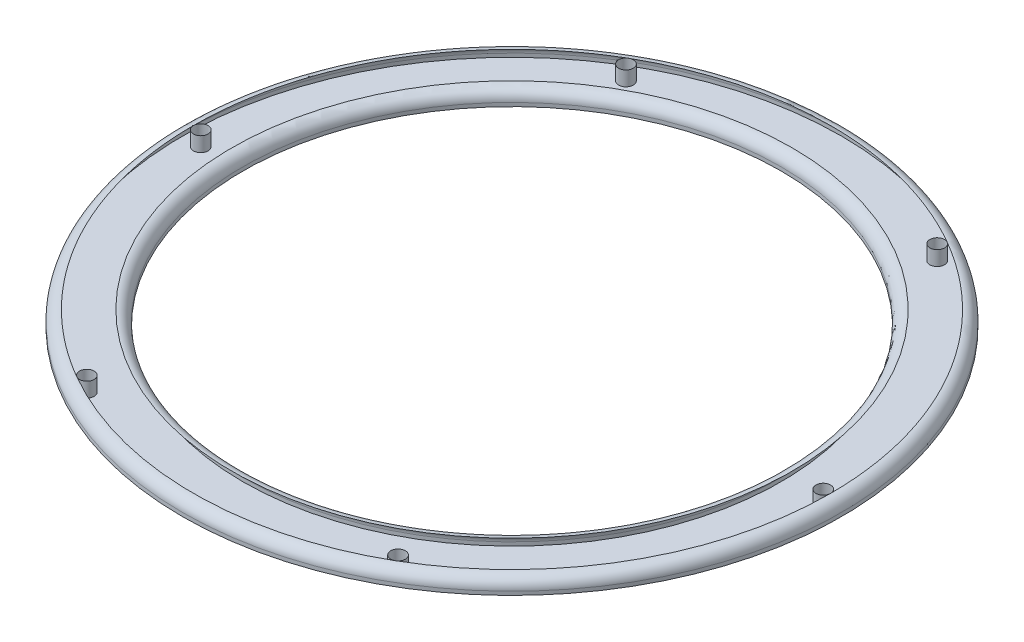
ISO-10303-21;
HEADER;
FILE_DESCRIPTION(('STEP AP214'),'2;1');
FILE_NAME('part.step','',(''),(''),'','','');
FILE_SCHEMA(('AUTOMOTIVE_DESIGN { 1 0 10303 214 1 1 1 1 }'));
ENDSEC;
DATA;
#1=APPLICATION_CONTEXT('core data for automotive mechanical design processes');
#2=APPLICATION_PROTOCOL_DEFINITION('international standard','automotive_design',2000,#1);
#3=PRODUCT_CONTEXT('',#1,'mechanical');
#4=PRODUCT('Part','Part','',(#3));
#5=PRODUCT_RELATED_PRODUCT_CATEGORY('part','',(#4));
#6=PRODUCT_DEFINITION_FORMATION('','',#4);
#7=PRODUCT_DEFINITION_CONTEXT('part definition',#1,'design');
#8=PRODUCT_DEFINITION('design','',#6,#7);
#9=PRODUCT_DEFINITION_SHAPE('','',#8);
#10=(LENGTH_UNIT() NAMED_UNIT(*) SI_UNIT(.MILLI.,.METRE.));
#11=(NAMED_UNIT(*) PLANE_ANGLE_UNIT() SI_UNIT($,.RADIAN.));
#12=(NAMED_UNIT(*) SI_UNIT($,.STERADIAN.) SOLID_ANGLE_UNIT());
#13=UNCERTAINTY_MEASURE_WITH_UNIT(LENGTH_MEASURE(1.E-05),#10,'distance_accuracy_value','');
#14=(GEOMETRIC_REPRESENTATION_CONTEXT(3) GLOBAL_UNCERTAINTY_ASSIGNED_CONTEXT((#13)) GLOBAL_UNIT_ASSIGNED_CONTEXT((#10,
#11,#12)) REPRESENTATION_CONTEXT('',''));
#15=CARTESIAN_POINT('',(0.,0.,0.));
#16=DIRECTION('',(0.,0.,1.));
#17=DIRECTION('',(1.,0.,0.));
#18=AXIS2_PLACEMENT_3D('',#15,#16,#17);
#19=CARTESIAN_POINT('',(0.,0.,0.));
#20=DIRECTION('',(0.,-1.,0.));
#21=DIRECTION('',(0.,0.,-1.));
#22=AXIS2_PLACEMENT_3D('',#19,#20,#21);
#23=CYLINDRICAL_SURFACE('',#22,73.5);
#24=CARTESIAN_POINT('',(0.,1.,0.));
#25=DIRECTION('',(0.,-1.,0.));
#26=DIRECTION('',(0.,0.,-1.));
#27=AXIS2_PLACEMENT_3D('',#24,#25,#26);
#28=CIRCLE('',#27,73.5);
#29=CARTESIAN_POINT('',(0.,1.,-73.5));
#30=VERTEX_POINT('',#29);
#31=EDGE_CURVE('E97',#30,#30,#28,.T.);
#32=ORIENTED_EDGE('',*,*,#31,.F.);
#33=EDGE_LOOP('',(#32));
#34=FACE_BOUND('',#33,.T.);
#35=CARTESIAN_POINT('',(0.,0.,0.));
#36=DIRECTION('',(0.,-1.,0.));
#37=DIRECTION('',(0.,0.,-1.));
#38=AXIS2_PLACEMENT_3D('',#35,#36,#37);
#39=CIRCLE('',#38,73.5);
#40=CARTESIAN_POINT('',(0.,0.,-73.5));
#41=VERTEX_POINT('',#40);
#42=EDGE_CURVE('E11',#41,#41,#39,.T.);
#43=ORIENTED_EDGE('',*,*,#42,.T.);
#44=EDGE_LOOP('',(#43));
#45=FACE_BOUND('',#44,.T.);
#46=ADVANCED_FACE('F39',(#34,#45),#23,.F.);
#47=CARTESIAN_POINT('',(-73.5,0.,0.));
#48=DIRECTION('',(0.,1.,0.));
#49=DIRECTION('',(0.,0.,1.));
#50=AXIS2_PLACEMENT_3D('',#47,#48,#49);
#51=PLANE('',#50);
#52=CARTESIAN_POINT('',(-42.5000000000009,0.,-73.6121593216768));
#53=DIRECTION('',(0.,1.,0.));
#54=DIRECTION('',(-0.866025403784433,0.,0.50000000000001));
#55=AXIS2_PLACEMENT_3D('',#52,#53,#54);
#56=CIRCLE('',#55,2.);
#57=CARTESIAN_POINT('',(-44.2320508075697,0.,-72.6121593216768));
#58=VERTEX_POINT('',#57);
#59=EDGE_CURVE('E200',#58,#58,#56,.T.);
#60=ORIENTED_EDGE('',*,*,#59,.T.);
#61=EDGE_LOOP('',(#60));
#62=FACE_BOUND('',#61,.T.);
#63=CARTESIAN_POINT('',(42.4999999999993,0.,-73.6121593216777));
#64=DIRECTION('',(0.,1.,0.));
#65=DIRECTION('',(-0.866025403784443,0.,-0.499999999999992));
#66=AXIS2_PLACEMENT_3D('',#63,#64,#65);
#67=CIRCLE('',#66,2.);
#68=CARTESIAN_POINT('',(40.7679491924304,0.,-74.6121593216777));
#69=VERTEX_POINT('',#68);
#70=EDGE_CURVE('E193',#69,#69,#67,.T.);
#71=ORIENTED_EDGE('',*,*,#70,.T.);
#72=EDGE_LOOP('',(#71));
#73=FACE_BOUND('',#72,.T.);
#74=CARTESIAN_POINT('',(85.,0.,0.));
#75=DIRECTION('',(0.,1.,0.));
#76=DIRECTION('',(0.,0.,-1.));
#77=AXIS2_PLACEMENT_3D('',#74,#75,#76);
#78=CIRCLE('',#77,2.);
#79=CARTESIAN_POINT('',(85.,0.,-2.));
#80=VERTEX_POINT('',#79);
#81=EDGE_CURVE('E184',#80,#80,#78,.T.);
#82=ORIENTED_EDGE('',*,*,#81,.T.);
#83=EDGE_LOOP('',(#82));
#84=FACE_BOUND('',#83,.T.);
#85=CARTESIAN_POINT('',(42.5000000000003,0.,73.6121593216771));
#86=DIRECTION('',(0.,1.,0.));
#87=DIRECTION('',(0.866025403784436,0.,-0.500000000000004));
#88=AXIS2_PLACEMENT_3D('',#85,#86,#87);
#89=CIRCLE('',#88,2.);
#90=CARTESIAN_POINT('',(44.2320508075692,0.,72.6121593216771));
#91=VERTEX_POINT('',#90);
#92=EDGE_CURVE('E178',#91,#91,#89,.T.);
#93=ORIENTED_EDGE('',*,*,#92,.T.);
#94=EDGE_LOOP('',(#93));
#95=FACE_BOUND('',#94,.T.);
#96=CARTESIAN_POINT('',(-42.4999999999998,0.,73.6121593216774));
#97=DIRECTION('',(0.,1.,0.));
#98=DIRECTION('',(0.86602540378444,0.,0.499999999999998));
#99=AXIS2_PLACEMENT_3D('',#96,#97,#98);
#100=CIRCLE('',#99,2.);
#101=CARTESIAN_POINT('',(-40.767949192431,0.,74.6121593216774));
#102=VERTEX_POINT('',#101);
#103=EDGE_CURVE('E92',#102,#102,#100,.T.);
#104=ORIENTED_EDGE('',*,*,#103,.T.);
#105=EDGE_LOOP('',(#104));
#106=FACE_BOUND('',#105,.T.);
#107=CARTESIAN_POINT('',(-85.,0.,0.));
#108=DIRECTION('',(0.,1.,0.));
#109=DIRECTION('',(0.,0.,1.));
#110=AXIS2_PLACEMENT_3D('',#107,#108,#109);
#111=CIRCLE('',#110,2.);
#112=CARTESIAN_POINT('',(-85.,0.,2.));
#113=VERTEX_POINT('',#112);
#114=EDGE_CURVE('E91',#113,#113,#111,.T.);
#115=ORIENTED_EDGE('',*,*,#114,.T.);
#116=EDGE_LOOP('',(#115));
#117=FACE_BOUND('',#116,.T.);
#118=ORIENTED_EDGE('',*,*,#42,.F.);
#119=EDGE_LOOP('',(#118));
#120=FACE_BOUND('',#119,.T.);
#121=CARTESIAN_POINT('',(0.,0.,0.));
#122=DIRECTION('',(0.,-1.,0.));
#123=DIRECTION('',(0.,0.,-1.));
#124=AXIS2_PLACEMENT_3D('',#121,#122,#123);
#125=CIRCLE('',#124,90.);
#126=CARTESIAN_POINT('',(0.,0.,-90.));
#127=VERTEX_POINT('',#126);
#128=EDGE_CURVE('E47',#127,#127,#125,.T.);
#129=ORIENTED_EDGE('',*,*,#128,.T.);
#130=EDGE_LOOP('',(#129));
#131=FACE_BOUND('',#130,.T.);
#132=ADVANCED_FACE('F118',(#62,#73,#84,#95,#106,#117,#120,#131),#51,.F.);
#133=CARTESIAN_POINT('',(0.,0.,0.));
#134=DIRECTION('',(0.,-1.,0.));
#135=DIRECTION('',(0.,0.,-1.));
#136=AXIS2_PLACEMENT_3D('',#133,#134,#135);
#137=CYLINDRICAL_SURFACE('',#136,90.);
#138=ORIENTED_EDGE('',*,*,#128,.F.);
#139=EDGE_LOOP('',(#138));
#140=FACE_BOUND('',#139,.T.);
#141=CARTESIAN_POINT('',(0.,0.999999999999998,0.));
#142=DIRECTION('',(0.,-1.,0.));
#143=DIRECTION('',(0.,0.,-1.));
#144=AXIS2_PLACEMENT_3D('',#141,#142,#143);
#145=CIRCLE('',#144,90.);
#146=CARTESIAN_POINT('',(0.,0.999999999999998,-90.));
#147=VERTEX_POINT('',#146);
#148=EDGE_CURVE('E110',#147,#147,#145,.T.);
#149=ORIENTED_EDGE('',*,*,#148,.T.);
#150=EDGE_LOOP('',(#149));
#151=FACE_BOUND('',#150,.T.);
#152=ADVANCED_FACE('F120',(#140,#151),#137,.T.);
#153=CARTESIAN_POINT('',(0.,0.999999999999998,0.));
#154=DIRECTION('',(0.,-1.,0.));
#155=DIRECTION('',(0.,0.,-1.));
#156=AXIS2_PLACEMENT_3D('',#153,#154,#155);
#157=TOROIDAL_SURFACE('',#156,87.,3.);
#158=ORIENTED_EDGE('',*,*,#148,.F.);
#159=EDGE_LOOP('',(#158));
#160=FACE_BOUND('',#159,.T.);
#161=CARTESIAN_POINT('',(0.,4.,0.));
#162=DIRECTION('',(0.,-1.,0.));
#163=DIRECTION('',(0.,0.,-1.));
#164=AXIS2_PLACEMENT_3D('',#161,#162,#163);
#165=CIRCLE('',#164,87.);
#166=CARTESIAN_POINT('',(-87.,4.,0.));
#167=VERTEX_POINT('',#166);
#168=CARTESIAN_POINT('',(-43.5000000000009,4.,-75.3442101292457));
#169=VERTEX_POINT('',#168);
#170=EDGE_CURVE('E78',#167,#169,#165,.T.);
#171=ORIENTED_EDGE('',*,*,#170,.T.);
#172=CARTESIAN_POINT('',(43.4999999999993,4.,-75.3442101292466));
#173=VERTEX_POINT('',#172);
#174=EDGE_CURVE('E111',#169,#173,#165,.T.);
#175=ORIENTED_EDGE('',*,*,#174,.T.);
#176=CARTESIAN_POINT('',(87.,4.,0.));
#177=VERTEX_POINT('',#176);
#178=EDGE_CURVE('E214',#173,#177,#165,.T.);
#179=ORIENTED_EDGE('',*,*,#178,.T.);
#180=CARTESIAN_POINT('',(43.5000000000003,4.,75.344210129246));
#181=VERTEX_POINT('',#180);
#182=EDGE_CURVE('E216',#177,#181,#165,.T.);
#183=ORIENTED_EDGE('',*,*,#182,.T.);
#184=CARTESIAN_POINT('',(-43.4999999999998,4.,75.3442101292463));
#185=VERTEX_POINT('',#184);
#186=EDGE_CURVE('E81',#181,#185,#165,.T.);
#187=ORIENTED_EDGE('',*,*,#186,.T.);
#188=EDGE_CURVE('E73',#185,#167,#165,.T.);
#189=ORIENTED_EDGE('',*,*,#188,.T.);
#190=EDGE_LOOP('',(#171,#175,#179,#183,#187,#189));
#191=FACE_BOUND('',#190,.T.);
#192=ADVANCED_FACE('F75',(#160,#191),#157,.T.);
#193=CARTESIAN_POINT('',(-76.5,4.,0.));
#194=DIRECTION('',(0.,-1.,0.));
#195=DIRECTION('',(0.,0.,-1.));
#196=AXIS2_PLACEMENT_3D('',#193,#194,#195);
#197=PLANE('',#196);
#198=ORIENTED_EDGE('',*,*,#174,.F.);
#199=CARTESIAN_POINT('',(-42.5000000000009,4.,-73.6121593216768));
#200=DIRECTION('',(0.,1.,0.));
#201=DIRECTION('',(-0.866025403784433,0.,0.50000000000001));
#202=AXIS2_PLACEMENT_3D('',#199,#200,#201);
#203=CIRCLE('',#202,2.);
#204=EDGE_CURVE('E204',#169,#169,#203,.T.);
#205=ORIENTED_EDGE('',*,*,#204,.F.);
#206=ORIENTED_EDGE('',*,*,#170,.F.);
#207=CARTESIAN_POINT('',(-85.,4.,0.));
#208=DIRECTION('',(0.,1.,0.));
#209=DIRECTION('',(0.,0.,1.));
#210=AXIS2_PLACEMENT_3D('',#207,#208,#209);
#211=CIRCLE('',#210,2.);
#212=EDGE_CURVE('E88',#167,#167,#211,.T.);
#213=ORIENTED_EDGE('',*,*,#212,.F.);
#214=ORIENTED_EDGE('',*,*,#188,.F.);
#215=CARTESIAN_POINT('',(-42.4999999999998,4.,73.6121593216774));
#216=DIRECTION('',(0.,1.,0.));
#217=DIRECTION('',(0.86602540378444,0.,0.499999999999998));
#218=AXIS2_PLACEMENT_3D('',#215,#216,#217);
#219=CIRCLE('',#218,2.);
#220=EDGE_CURVE('E52',#185,#185,#219,.T.);
#221=ORIENTED_EDGE('',*,*,#220,.F.);
#222=ORIENTED_EDGE('',*,*,#186,.F.);
#223=CARTESIAN_POINT('',(42.5000000000003,4.,73.6121593216771));
#224=DIRECTION('',(0.,1.,0.));
#225=DIRECTION('',(0.866025403784436,0.,-0.500000000000004));
#226=AXIS2_PLACEMENT_3D('',#223,#224,#225);
#227=CIRCLE('',#226,2.);
#228=EDGE_CURVE('E57',#181,#181,#227,.T.);
#229=ORIENTED_EDGE('',*,*,#228,.F.);
#230=ORIENTED_EDGE('',*,*,#182,.F.);
#231=CARTESIAN_POINT('',(85.,4.,0.));
#232=DIRECTION('',(0.,1.,0.));
#233=DIRECTION('',(0.,0.,-1.));
#234=AXIS2_PLACEMENT_3D('',#231,#232,#233);
#235=CIRCLE('',#234,2.);
#236=EDGE_CURVE('E190',#177,#177,#235,.T.);
#237=ORIENTED_EDGE('',*,*,#236,.F.);
#238=ORIENTED_EDGE('',*,*,#178,.F.);
#239=CARTESIAN_POINT('',(42.4999999999993,4.,-73.6121593216777));
#240=DIRECTION('',(0.,1.,0.));
#241=DIRECTION('',(-0.866025403784443,0.,-0.499999999999992));
#242=AXIS2_PLACEMENT_3D('',#239,#240,#241);
#243=CIRCLE('',#242,2.);
#244=EDGE_CURVE('E197',#173,#173,#243,.T.);
#245=ORIENTED_EDGE('',*,*,#244,.F.);
#246=EDGE_LOOP('',(#198,#205,#206,#213,#214,#221,#222,#229,#230,#237,#238,#245));
#247=FACE_BOUND('',#246,.T.);
#248=CARTESIAN_POINT('',(0.,4.,0.));
#249=DIRECTION('',(0.,-1.,0.));
#250=DIRECTION('',(0.,0.,-1.));
#251=AXIS2_PLACEMENT_3D('',#248,#249,#250);
#252=CIRCLE('',#251,76.5);
#253=CARTESIAN_POINT('',(0.,4.,-76.5));
#254=VERTEX_POINT('',#253);
#255=EDGE_CURVE('E85',#254,#254,#252,.T.);
#256=ORIENTED_EDGE('',*,*,#255,.T.);
#257=EDGE_LOOP('',(#256));
#258=FACE_BOUND('',#257,.T.);
#259=ADVANCED_FACE('F127',(#247,#258),#197,.F.);
#260=CARTESIAN_POINT('',(0.,1.,0.));
#261=DIRECTION('',(0.,-1.,0.));
#262=DIRECTION('',(0.,0.,-1.));
#263=AXIS2_PLACEMENT_3D('',#260,#261,#262);
#264=TOROIDAL_SURFACE('',#263,76.5,3.);
#265=ORIENTED_EDGE('',*,*,#255,.F.);
#266=EDGE_LOOP('',(#265));
#267=FACE_BOUND('',#266,.T.);
#268=ORIENTED_EDGE('',*,*,#31,.T.);
#269=EDGE_LOOP('',(#268));
#270=FACE_BOUND('',#269,.T.);
#271=ADVANCED_FACE('F132',(#267,#270),#264,.T.);
#272=CARTESIAN_POINT('',(-85.,0.,0.));
#273=DIRECTION('',(0.,1.,0.));
#274=DIRECTION('',(0.,0.,1.));
#275=AXIS2_PLACEMENT_3D('',#272,#273,#274);
#276=CYLINDRICAL_SURFACE('',#275,2.);
#277=ORIENTED_EDGE('',*,*,#114,.F.);
#278=EDGE_LOOP('',(#277));
#279=FACE_BOUND('',#278,.T.);
#280=ORIENTED_EDGE('',*,*,#212,.T.);
#281=EDGE_LOOP('',(#280));
#282=FACE_BOUND('',#281,.T.);
#283=ADVANCED_FACE('F89',(#279,#282),#276,.F.);
#284=CARTESIAN_POINT('',(-42.4999999999998,0.,73.6121593216774));
#285=DIRECTION('',(0.,1.,0.));
#286=DIRECTION('',(0.,0.,1.));
#287=AXIS2_PLACEMENT_3D('',#284,#285,#286);
#288=CYLINDRICAL_SURFACE('',#287,2.);
#289=ORIENTED_EDGE('',*,*,#103,.F.);
#290=EDGE_LOOP('',(#289));
#291=FACE_BOUND('',#290,.T.);
#292=ORIENTED_EDGE('',*,*,#220,.T.);
#293=EDGE_LOOP('',(#292));
#294=FACE_BOUND('',#293,.T.);
#295=ADVANCED_FACE('F151',(#291,#294),#288,.F.);
#296=CARTESIAN_POINT('',(42.5000000000003,0.,73.6121593216771));
#297=DIRECTION('',(0.,1.,0.));
#298=DIRECTION('',(0.,0.,1.));
#299=AXIS2_PLACEMENT_3D('',#296,#297,#298);
#300=CYLINDRICAL_SURFACE('',#299,2.);
#301=ORIENTED_EDGE('',*,*,#92,.F.);
#302=EDGE_LOOP('',(#301));
#303=FACE_BOUND('',#302,.T.);
#304=ORIENTED_EDGE('',*,*,#228,.T.);
#305=EDGE_LOOP('',(#304));
#306=FACE_BOUND('',#305,.T.);
#307=ADVANCED_FACE('F158',(#303,#306),#300,.F.);
#308=CARTESIAN_POINT('',(85.,0.,0.));
#309=DIRECTION('',(0.,1.,0.));
#310=DIRECTION('',(0.,0.,1.));
#311=AXIS2_PLACEMENT_3D('',#308,#309,#310);
#312=CYLINDRICAL_SURFACE('',#311,2.);
#313=ORIENTED_EDGE('',*,*,#81,.F.);
#314=EDGE_LOOP('',(#313));
#315=FACE_BOUND('',#314,.T.);
#316=ORIENTED_EDGE('',*,*,#236,.T.);
#317=EDGE_LOOP('',(#316));
#318=FACE_BOUND('',#317,.T.);
#319=ADVANCED_FACE('F167',(#315,#318),#312,.F.);
#320=CARTESIAN_POINT('',(42.4999999999993,0.,-73.6121593216777));
#321=DIRECTION('',(0.,1.,0.));
#322=DIRECTION('',(0.,0.,1.));
#323=AXIS2_PLACEMENT_3D('',#320,#321,#322);
#324=CYLINDRICAL_SURFACE('',#323,2.);
#325=ORIENTED_EDGE('',*,*,#70,.F.);
#326=EDGE_LOOP('',(#325));
#327=FACE_BOUND('',#326,.T.);
#328=ORIENTED_EDGE('',*,*,#244,.T.);
#329=EDGE_LOOP('',(#328));
#330=FACE_BOUND('',#329,.T.);
#331=ADVANCED_FACE('F163',(#327,#330),#324,.F.);
#332=CARTESIAN_POINT('',(-42.5000000000009,0.,-73.6121593216768));
#333=DIRECTION('',(0.,1.,0.));
#334=DIRECTION('',(0.,0.,1.));
#335=AXIS2_PLACEMENT_3D('',#332,#333,#334);
#336=CYLINDRICAL_SURFACE('',#335,2.);
#337=ORIENTED_EDGE('',*,*,#59,.F.);
#338=EDGE_LOOP('',(#337));
#339=FACE_BOUND('',#338,.T.);
#340=ORIENTED_EDGE('',*,*,#204,.T.);
#341=EDGE_LOOP('',(#340));
#342=FACE_BOUND('',#341,.T.);
#343=ADVANCED_FACE('F160',(#339,#342),#336,.F.);
#344=CLOSED_SHELL('',(#46,#132,#152,#192,#259,#271,#283,#295,#307,#319,#331,#343));
#345=MANIFOLD_SOLID_BREP('B2',#344);
#346=ADVANCED_BREP_SHAPE_REPRESENTATION('',(#18,#345),#14);
#347=SHAPE_DEFINITION_REPRESENTATION(#9,#346);
ENDSEC;
END-ISO-10303-21;
